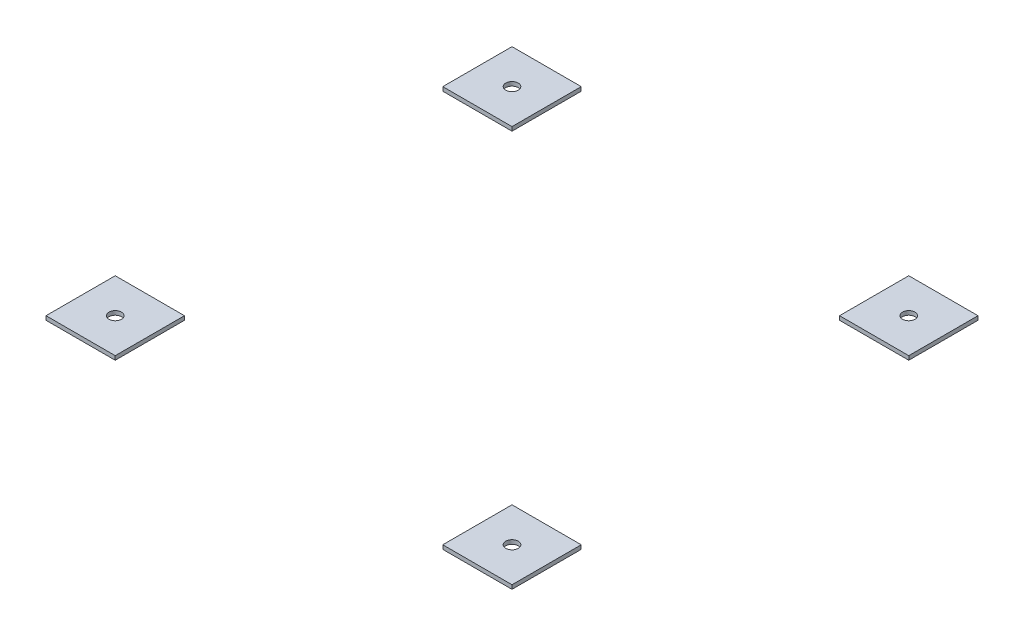
ISO-10303-21;
HEADER;
FILE_DESCRIPTION(('STEP AP214'),'2;1');
FILE_NAME('part.step','',(''),(''),'','','');
FILE_SCHEMA(('AUTOMOTIVE_DESIGN { 1 0 10303 214 1 1 1 1 }'));
ENDSEC;
DATA;
#1=APPLICATION_CONTEXT('core data for automotive mechanical design processes');
#2=APPLICATION_PROTOCOL_DEFINITION('international standard','automotive_design',2000,#1);
#3=PRODUCT_CONTEXT('',#1,'mechanical');
#4=PRODUCT('Part','Part','',(#3));
#5=PRODUCT_RELATED_PRODUCT_CATEGORY('part','',(#4));
#6=PRODUCT_DEFINITION_FORMATION('','',#4);
#7=PRODUCT_DEFINITION_CONTEXT('part definition',#1,'design');
#8=PRODUCT_DEFINITION('design','',#6,#7);
#9=PRODUCT_DEFINITION_SHAPE('','',#8);
#10=(LENGTH_UNIT() NAMED_UNIT(*) SI_UNIT(.MILLI.,.METRE.));
#11=(NAMED_UNIT(*) PLANE_ANGLE_UNIT() SI_UNIT($,.RADIAN.));
#12=(NAMED_UNIT(*) SI_UNIT($,.STERADIAN.) SOLID_ANGLE_UNIT());
#13=UNCERTAINTY_MEASURE_WITH_UNIT(LENGTH_MEASURE(1.E-05),#10,'distance_accuracy_value','');
#14=(GEOMETRIC_REPRESENTATION_CONTEXT(3) GLOBAL_UNCERTAINTY_ASSIGNED_CONTEXT((#13)) GLOBAL_UNIT_ASSIGNED_CONTEXT((#10,
#11,#12)) REPRESENTATION_CONTEXT('',''));
#15=CARTESIAN_POINT('',(0.,0.,0.));
#16=DIRECTION('',(0.,0.,1.));
#17=DIRECTION('',(1.,0.,0.));
#18=AXIS2_PLACEMENT_3D('',#15,#16,#17);
#19=CARTESIAN_POINT('',(0.,1.5,0.));
#20=DIRECTION('',(0.,-1.,0.));
#21=DIRECTION('',(0.,0.,-1.));
#22=AXIS2_PLACEMENT_3D('',#19,#20,#21);
#23=PLANE('',#22);
#24=DIRECTION('',(0.,0.,1.));
#25=VECTOR('',#24,1.);
#26=CARTESIAN_POINT('',(-175.,1.5,175.));
#27=LINE('',#26,#25);
#28=CARTESIAN_POINT('',(-175.,1.5,123.));
#29=VERTEX_POINT('',#28);
#30=CARTESIAN_POINT('',(-175.,1.5,175.));
#31=VERTEX_POINT('',#30);
#32=EDGE_CURVE('E114',#29,#31,#27,.T.);
#33=ORIENTED_EDGE('',*,*,#32,.T.);
#34=DIRECTION('',(1.,0.,0.));
#35=VECTOR('',#34,1.);
#36=CARTESIAN_POINT('',(-175.,1.5,175.));
#37=LINE('',#36,#35);
#38=CARTESIAN_POINT('',(-123.,1.5,175.));
#39=VERTEX_POINT('',#38);
#40=EDGE_CURVE('E83',#31,#39,#37,.T.);
#41=ORIENTED_EDGE('',*,*,#40,.T.);
#42=DIRECTION('',(0.,0.,-1.));
#43=VECTOR('',#42,1.);
#44=CARTESIAN_POINT('',(-123.,1.5,175.));
#45=LINE('',#44,#43);
#46=CARTESIAN_POINT('',(-123.,1.5,123.));
#47=VERTEX_POINT('',#46);
#48=EDGE_CURVE('E122',#39,#47,#45,.T.);
#49=ORIENTED_EDGE('',*,*,#48,.T.);
#50=DIRECTION('',(-1.,0.,0.));
#51=VECTOR('',#50,1.);
#52=CARTESIAN_POINT('',(-175.,1.5,123.));
#53=LINE('',#52,#51);
#54=EDGE_CURVE('E107',#47,#29,#53,.T.);
#55=ORIENTED_EDGE('',*,*,#54,.T.);
#56=EDGE_LOOP('',(#33,#41,#49,#55));
#57=FACE_BOUND('',#56,.T.);
#58=CARTESIAN_POINT('',(-149.,1.5,149.));
#59=DIRECTION('',(0.,1.,0.));
#60=DIRECTION('',(0.,0.,1.));
#61=AXIS2_PLACEMENT_3D('',#58,#59,#60);
#62=CIRCLE('',#61,4.67999999999999);
#63=CARTESIAN_POINT('',(-149.,1.5,153.68));
#64=VERTEX_POINT('',#63);
#65=EDGE_CURVE('E54',#64,#64,#62,.T.);
#66=ORIENTED_EDGE('',*,*,#65,.F.);
#67=EDGE_LOOP('',(#66));
#68=FACE_BOUND('',#67,.T.);
#69=ADVANCED_FACE('F50',(#57,#68),#23,.F.);
#70=CARTESIAN_POINT('',(0.,-1.5,0.));
#71=DIRECTION('',(0.,-1.,0.));
#72=DIRECTION('',(0.,0.,-1.));
#73=AXIS2_PLACEMENT_3D('',#70,#71,#72);
#74=PLANE('',#73);
#75=DIRECTION('',(0.,0.,1.));
#76=VECTOR('',#75,1.);
#77=CARTESIAN_POINT('',(-175.,-1.5,175.));
#78=LINE('',#77,#76);
#79=CARTESIAN_POINT('',(-175.,-1.5,123.));
#80=VERTEX_POINT('',#79);
#81=CARTESIAN_POINT('',(-175.,-1.5,175.));
#82=VERTEX_POINT('',#81);
#83=EDGE_CURVE('E113',#80,#82,#78,.T.);
#84=ORIENTED_EDGE('',*,*,#83,.F.);
#85=DIRECTION('',(-1.,0.,0.));
#86=VECTOR('',#85,1.);
#87=CARTESIAN_POINT('',(-175.,-1.5,123.));
#88=LINE('',#87,#86);
#89=CARTESIAN_POINT('',(-123.,-1.5,123.));
#90=VERTEX_POINT('',#89);
#91=EDGE_CURVE('E93',#90,#80,#88,.T.);
#92=ORIENTED_EDGE('',*,*,#91,.F.);
#93=DIRECTION('',(0.,0.,-1.));
#94=VECTOR('',#93,1.);
#95=CARTESIAN_POINT('',(-123.,-1.5,175.));
#96=LINE('',#95,#94);
#97=CARTESIAN_POINT('',(-123.,-1.5,175.));
#98=VERTEX_POINT('',#97);
#99=EDGE_CURVE('E99',#98,#90,#96,.T.);
#100=ORIENTED_EDGE('',*,*,#99,.F.);
#101=DIRECTION('',(1.,0.,0.));
#102=VECTOR('',#101,1.);
#103=CARTESIAN_POINT('',(-175.,-1.5,175.));
#104=LINE('',#103,#102);
#105=EDGE_CURVE('E67',#82,#98,#104,.T.);
#106=ORIENTED_EDGE('',*,*,#105,.F.);
#107=EDGE_LOOP('',(#84,#92,#100,#106));
#108=FACE_BOUND('',#107,.T.);
#109=CARTESIAN_POINT('',(-149.,-1.5,149.));
#110=DIRECTION('',(0.,1.,0.));
#111=DIRECTION('',(0.,0.,1.));
#112=AXIS2_PLACEMENT_3D('',#109,#110,#111);
#113=CIRCLE('',#112,4.67999999999999);
#114=CARTESIAN_POINT('',(-149.,-1.5,153.68));
#115=VERTEX_POINT('',#114);
#116=EDGE_CURVE('E12',#115,#115,#113,.T.);
#117=ORIENTED_EDGE('',*,*,#116,.T.);
#118=EDGE_LOOP('',(#117));
#119=FACE_BOUND('',#118,.T.);
#120=ADVANCED_FACE('F110',(#108,#119),#74,.T.);
#121=CARTESIAN_POINT('',(-175.,1.5,175.));
#122=DIRECTION('',(1.,0.,0.));
#123=DIRECTION('',(0.,0.,-1.));
#124=AXIS2_PLACEMENT_3D('',#121,#122,#123);
#125=PLANE('',#124);
#126=ORIENTED_EDGE('',*,*,#83,.T.);
#127=DIRECTION('',(0.,-1.,0.));
#128=VECTOR('',#127,1.);
#129=CARTESIAN_POINT('',(-175.,1.5,175.));
#130=LINE('',#129,#128);
#131=EDGE_CURVE('E129',#31,#82,#130,.T.);
#132=ORIENTED_EDGE('',*,*,#131,.F.);
#133=ORIENTED_EDGE('',*,*,#32,.F.);
#134=DIRECTION('',(0.,-1.,0.));
#135=VECTOR('',#134,1.);
#136=CARTESIAN_POINT('',(-175.,1.5,123.));
#137=LINE('',#136,#135);
#138=EDGE_CURVE('E108',#29,#80,#137,.T.);
#139=ORIENTED_EDGE('',*,*,#138,.T.);
#140=EDGE_LOOP('',(#126,#132,#133,#139));
#141=FACE_BOUND('',#140,.T.);
#142=ADVANCED_FACE('F128',(#141),#125,.F.);
#143=CARTESIAN_POINT('',(-175.,1.5,175.));
#144=DIRECTION('',(0.,0.,-1.));
#145=DIRECTION('',(-1.,0.,0.));
#146=AXIS2_PLACEMENT_3D('',#143,#144,#145);
#147=PLANE('',#146);
#148=ORIENTED_EDGE('',*,*,#105,.T.);
#149=DIRECTION('',(0.,-1.,0.));
#150=VECTOR('',#149,1.);
#151=CARTESIAN_POINT('',(-123.,1.5,175.));
#152=LINE('',#151,#150);
#153=EDGE_CURVE('E104',#39,#98,#152,.T.);
#154=ORIENTED_EDGE('',*,*,#153,.F.);
#155=ORIENTED_EDGE('',*,*,#40,.F.);
#156=ORIENTED_EDGE('',*,*,#131,.T.);
#157=EDGE_LOOP('',(#148,#154,#155,#156));
#158=FACE_BOUND('',#157,.T.);
#159=ADVANCED_FACE('F132',(#158),#147,.F.);
#160=CARTESIAN_POINT('',(-123.,1.5,175.));
#161=DIRECTION('',(-1.,0.,0.));
#162=DIRECTION('',(0.,0.,1.));
#163=AXIS2_PLACEMENT_3D('',#160,#161,#162);
#164=PLANE('',#163);
#165=ORIENTED_EDGE('',*,*,#99,.T.);
#166=DIRECTION('',(0.,-1.,0.));
#167=VECTOR('',#166,1.);
#168=CARTESIAN_POINT('',(-123.,1.5,123.));
#169=LINE('',#168,#167);
#170=EDGE_CURVE('E102',#47,#90,#169,.T.);
#171=ORIENTED_EDGE('',*,*,#170,.F.);
#172=ORIENTED_EDGE('',*,*,#48,.F.);
#173=ORIENTED_EDGE('',*,*,#153,.T.);
#174=EDGE_LOOP('',(#165,#171,#172,#173));
#175=FACE_BOUND('',#174,.T.);
#176=ADVANCED_FACE('F100',(#175),#164,.F.);
#177=CARTESIAN_POINT('',(-175.,1.5,123.));
#178=DIRECTION('',(0.,0.,1.));
#179=DIRECTION('',(1.,0.,0.));
#180=AXIS2_PLACEMENT_3D('',#177,#178,#179);
#181=PLANE('',#180);
#182=ORIENTED_EDGE('',*,*,#91,.T.);
#183=ORIENTED_EDGE('',*,*,#138,.F.);
#184=ORIENTED_EDGE('',*,*,#54,.F.);
#185=ORIENTED_EDGE('',*,*,#170,.T.);
#186=EDGE_LOOP('',(#182,#183,#184,#185));
#187=FACE_BOUND('',#186,.T.);
#188=ADVANCED_FACE('F106',(#187),#181,.F.);
#189=CARTESIAN_POINT('',(-149.,1.5,149.));
#190=DIRECTION('',(0.,-1.,0.));
#191=DIRECTION('',(0.,0.,-1.));
#192=AXIS2_PLACEMENT_3D('',#189,#190,#191);
#193=CYLINDRICAL_SURFACE('',#192,4.67999999999999);
#194=ORIENTED_EDGE('',*,*,#65,.T.);
#195=EDGE_LOOP('',(#194));
#196=FACE_BOUND('',#195,.T.);
#197=ORIENTED_EDGE('',*,*,#116,.F.);
#198=EDGE_LOOP('',(#197));
#199=FACE_BOUND('',#198,.T.);
#200=ADVANCED_FACE('F52',(#196,#199),#193,.F.);
#201=CLOSED_SHELL('',(#69,#120,#142,#159,#176,#188,#200));
#202=MANIFOLD_SOLID_BREP('B2',#201);
#203=CARTESIAN_POINT('',(0.,1.5,0.));
#204=DIRECTION('',(0.,-1.,0.));
#205=DIRECTION('',(0.,0.,-1.));
#206=AXIS2_PLACEMENT_3D('',#203,#204,#205);
#207=PLANE('',#206);
#208=DIRECTION('',(0.,0.,1.));
#209=VECTOR('',#208,1.);
#210=CARTESIAN_POINT('',(123.,1.5,175.));
#211=LINE('',#210,#209);
#212=CARTESIAN_POINT('',(123.,1.5,123.));
#213=VERTEX_POINT('',#212);
#214=CARTESIAN_POINT('',(123.,1.5,175.));
#215=VERTEX_POINT('',#214);
#216=EDGE_CURVE('E269',#213,#215,#211,.T.);
#217=ORIENTED_EDGE('',*,*,#216,.T.);
#218=DIRECTION('',(1.,0.,0.));
#219=VECTOR('',#218,1.);
#220=CARTESIAN_POINT('',(123.,1.5,175.));
#221=LINE('',#220,#219);
#222=CARTESIAN_POINT('',(175.,1.5,175.));
#223=VERTEX_POINT('',#222);
#224=EDGE_CURVE('E238',#215,#223,#221,.T.);
#225=ORIENTED_EDGE('',*,*,#224,.T.);
#226=DIRECTION('',(0.,0.,-1.));
#227=VECTOR('',#226,1.);
#228=CARTESIAN_POINT('',(175.,1.5,175.));
#229=LINE('',#228,#227);
#230=CARTESIAN_POINT('',(175.,1.5,123.));
#231=VERTEX_POINT('',#230);
#232=EDGE_CURVE('E277',#223,#231,#229,.T.);
#233=ORIENTED_EDGE('',*,*,#232,.T.);
#234=DIRECTION('',(-1.,0.,0.));
#235=VECTOR('',#234,1.);
#236=CARTESIAN_POINT('',(123.,1.5,123.));
#237=LINE('',#236,#235);
#238=EDGE_CURVE('E262',#231,#213,#237,.T.);
#239=ORIENTED_EDGE('',*,*,#238,.T.);
#240=EDGE_LOOP('',(#217,#225,#233,#239));
#241=FACE_BOUND('',#240,.T.);
#242=CARTESIAN_POINT('',(149.,1.5,149.));
#243=DIRECTION('',(0.,1.,0.));
#244=DIRECTION('',(0.,0.,1.));
#245=AXIS2_PLACEMENT_3D('',#242,#243,#244);
#246=CIRCLE('',#245,4.67999999999999);
#247=CARTESIAN_POINT('',(149.,1.5,153.68));
#248=VERTEX_POINT('',#247);
#249=EDGE_CURVE('E209',#248,#248,#246,.T.);
#250=ORIENTED_EDGE('',*,*,#249,.F.);
#251=EDGE_LOOP('',(#250));
#252=FACE_BOUND('',#251,.T.);
#253=ADVANCED_FACE('F205',(#241,#252),#207,.F.);
#254=CARTESIAN_POINT('',(0.,-1.5,0.));
#255=DIRECTION('',(0.,-1.,0.));
#256=DIRECTION('',(0.,0.,-1.));
#257=AXIS2_PLACEMENT_3D('',#254,#255,#256);
#258=PLANE('',#257);
#259=DIRECTION('',(0.,0.,1.));
#260=VECTOR('',#259,1.);
#261=CARTESIAN_POINT('',(123.,-1.5,175.));
#262=LINE('',#261,#260);
#263=CARTESIAN_POINT('',(123.,-1.5,123.));
#264=VERTEX_POINT('',#263);
#265=CARTESIAN_POINT('',(123.,-1.5,175.));
#266=VERTEX_POINT('',#265);
#267=EDGE_CURVE('E268',#264,#266,#262,.T.);
#268=ORIENTED_EDGE('',*,*,#267,.F.);
#269=DIRECTION('',(-1.,0.,0.));
#270=VECTOR('',#269,1.);
#271=CARTESIAN_POINT('',(123.,-1.5,123.));
#272=LINE('',#271,#270);
#273=CARTESIAN_POINT('',(175.,-1.5,123.));
#274=VERTEX_POINT('',#273);
#275=EDGE_CURVE('E248',#274,#264,#272,.T.);
#276=ORIENTED_EDGE('',*,*,#275,.F.);
#277=DIRECTION('',(0.,0.,-1.));
#278=VECTOR('',#277,1.);
#279=CARTESIAN_POINT('',(175.,-1.5,175.));
#280=LINE('',#279,#278);
#281=CARTESIAN_POINT('',(175.,-1.5,175.));
#282=VERTEX_POINT('',#281);
#283=EDGE_CURVE('E254',#282,#274,#280,.T.);
#284=ORIENTED_EDGE('',*,*,#283,.F.);
#285=DIRECTION('',(1.,0.,0.));
#286=VECTOR('',#285,1.);
#287=CARTESIAN_POINT('',(123.,-1.5,175.));
#288=LINE('',#287,#286);
#289=EDGE_CURVE('E222',#266,#282,#288,.T.);
#290=ORIENTED_EDGE('',*,*,#289,.F.);
#291=EDGE_LOOP('',(#268,#276,#284,#290));
#292=FACE_BOUND('',#291,.T.);
#293=CARTESIAN_POINT('',(149.,-1.5,149.));
#294=DIRECTION('',(0.,1.,0.));
#295=DIRECTION('',(0.,0.,1.));
#296=AXIS2_PLACEMENT_3D('',#293,#294,#295);
#297=CIRCLE('',#296,4.67999999999999);
#298=CARTESIAN_POINT('',(149.,-1.5,153.68));
#299=VERTEX_POINT('',#298);
#300=EDGE_CURVE('E48',#299,#299,#297,.T.);
#301=ORIENTED_EDGE('',*,*,#300,.T.);
#302=EDGE_LOOP('',(#301));
#303=FACE_BOUND('',#302,.T.);
#304=ADVANCED_FACE('F265',(#292,#303),#258,.T.);
#305=CARTESIAN_POINT('',(123.,1.5,175.));
#306=DIRECTION('',(1.,0.,0.));
#307=DIRECTION('',(0.,0.,-1.));
#308=AXIS2_PLACEMENT_3D('',#305,#306,#307);
#309=PLANE('',#308);
#310=ORIENTED_EDGE('',*,*,#267,.T.);
#311=DIRECTION('',(0.,-1.,0.));
#312=VECTOR('',#311,1.);
#313=CARTESIAN_POINT('',(123.,1.5,175.));
#314=LINE('',#313,#312);
#315=EDGE_CURVE('E284',#215,#266,#314,.T.);
#316=ORIENTED_EDGE('',*,*,#315,.F.);
#317=ORIENTED_EDGE('',*,*,#216,.F.);
#318=DIRECTION('',(0.,-1.,0.));
#319=VECTOR('',#318,1.);
#320=CARTESIAN_POINT('',(123.,1.5,123.));
#321=LINE('',#320,#319);
#322=EDGE_CURVE('E263',#213,#264,#321,.T.);
#323=ORIENTED_EDGE('',*,*,#322,.T.);
#324=EDGE_LOOP('',(#310,#316,#317,#323));
#325=FACE_BOUND('',#324,.T.);
#326=ADVANCED_FACE('F283',(#325),#309,.F.);
#327=CARTESIAN_POINT('',(123.,1.5,175.));
#328=DIRECTION('',(0.,0.,-1.));
#329=DIRECTION('',(-1.,0.,0.));
#330=AXIS2_PLACEMENT_3D('',#327,#328,#329);
#331=PLANE('',#330);
#332=ORIENTED_EDGE('',*,*,#289,.T.);
#333=DIRECTION('',(0.,-1.,0.));
#334=VECTOR('',#333,1.);
#335=CARTESIAN_POINT('',(175.,1.5,175.));
#336=LINE('',#335,#334);
#337=EDGE_CURVE('E259',#223,#282,#336,.T.);
#338=ORIENTED_EDGE('',*,*,#337,.F.);
#339=ORIENTED_EDGE('',*,*,#224,.F.);
#340=ORIENTED_EDGE('',*,*,#315,.T.);
#341=EDGE_LOOP('',(#332,#338,#339,#340));
#342=FACE_BOUND('',#341,.T.);
#343=ADVANCED_FACE('F287',(#342),#331,.F.);
#344=CARTESIAN_POINT('',(175.,1.5,175.));
#345=DIRECTION('',(-1.,0.,0.));
#346=DIRECTION('',(0.,0.,1.));
#347=AXIS2_PLACEMENT_3D('',#344,#345,#346);
#348=PLANE('',#347);
#349=ORIENTED_EDGE('',*,*,#283,.T.);
#350=DIRECTION('',(0.,-1.,0.));
#351=VECTOR('',#350,1.);
#352=CARTESIAN_POINT('',(175.,1.5,123.));
#353=LINE('',#352,#351);
#354=EDGE_CURVE('E257',#231,#274,#353,.T.);
#355=ORIENTED_EDGE('',*,*,#354,.F.);
#356=ORIENTED_EDGE('',*,*,#232,.F.);
#357=ORIENTED_EDGE('',*,*,#337,.T.);
#358=EDGE_LOOP('',(#349,#355,#356,#357));
#359=FACE_BOUND('',#358,.T.);
#360=ADVANCED_FACE('F255',(#359),#348,.F.);
#361=CARTESIAN_POINT('',(123.,1.5,123.));
#362=DIRECTION('',(0.,0.,1.));
#363=DIRECTION('',(1.,0.,0.));
#364=AXIS2_PLACEMENT_3D('',#361,#362,#363);
#365=PLANE('',#364);
#366=ORIENTED_EDGE('',*,*,#275,.T.);
#367=ORIENTED_EDGE('',*,*,#322,.F.);
#368=ORIENTED_EDGE('',*,*,#238,.F.);
#369=ORIENTED_EDGE('',*,*,#354,.T.);
#370=EDGE_LOOP('',(#366,#367,#368,#369));
#371=FACE_BOUND('',#370,.T.);
#372=ADVANCED_FACE('F261',(#371),#365,.F.);
#373=CARTESIAN_POINT('',(149.,1.5,149.));
#374=DIRECTION('',(0.,-1.,0.));
#375=DIRECTION('',(0.,0.,-1.));
#376=AXIS2_PLACEMENT_3D('',#373,#374,#375);
#377=CYLINDRICAL_SURFACE('',#376,4.67999999999999);
#378=ORIENTED_EDGE('',*,*,#249,.T.);
#379=EDGE_LOOP('',(#378));
#380=FACE_BOUND('',#379,.T.);
#381=ORIENTED_EDGE('',*,*,#300,.F.);
#382=EDGE_LOOP('',(#381));
#383=FACE_BOUND('',#382,.T.);
#384=ADVANCED_FACE('F207',(#380,#383),#377,.F.);
#385=CLOSED_SHELL('',(#253,#304,#326,#343,#360,#372,#384));
#386=MANIFOLD_SOLID_BREP('B6',#385);
#387=CARTESIAN_POINT('',(0.,1.5,0.));
#388=DIRECTION('',(0.,-1.,0.));
#389=DIRECTION('',(0.,0.,-1.));
#390=AXIS2_PLACEMENT_3D('',#387,#388,#389);
#391=PLANE('',#390);
#392=DIRECTION('',(0.,0.,1.));
#393=VECTOR('',#392,1.);
#394=CARTESIAN_POINT('',(-175.,1.5,-123.));
#395=LINE('',#394,#393);
#396=CARTESIAN_POINT('',(-175.,1.5,-175.));
#397=VERTEX_POINT('',#396);
#398=CARTESIAN_POINT('',(-175.,1.5,-123.));
#399=VERTEX_POINT('',#398);
#400=EDGE_CURVE('E423',#397,#399,#395,.T.);
#401=ORIENTED_EDGE('',*,*,#400,.T.);
#402=DIRECTION('',(1.,0.,0.));
#403=VECTOR('',#402,1.);
#404=CARTESIAN_POINT('',(-175.,1.5,-123.));
#405=LINE('',#404,#403);
#406=CARTESIAN_POINT('',(-123.,1.5,-123.));
#407=VERTEX_POINT('',#406);
#408=EDGE_CURVE('E392',#399,#407,#405,.T.);
#409=ORIENTED_EDGE('',*,*,#408,.T.);
#410=DIRECTION('',(0.,0.,-1.));
#411=VECTOR('',#410,1.);
#412=CARTESIAN_POINT('',(-123.,1.5,-123.));
#413=LINE('',#412,#411);
#414=CARTESIAN_POINT('',(-123.,1.5,-175.));
#415=VERTEX_POINT('',#414);
#416=EDGE_CURVE('E431',#407,#415,#413,.T.);
#417=ORIENTED_EDGE('',*,*,#416,.T.);
#418=DIRECTION('',(-1.,0.,0.));
#419=VECTOR('',#418,1.);
#420=CARTESIAN_POINT('',(-175.,1.5,-175.));
#421=LINE('',#420,#419);
#422=EDGE_CURVE('E416',#415,#397,#421,.T.);
#423=ORIENTED_EDGE('',*,*,#422,.T.);
#424=EDGE_LOOP('',(#401,#409,#417,#423));
#425=FACE_BOUND('',#424,.T.);
#426=CARTESIAN_POINT('',(-149.,1.5,-149.));
#427=DIRECTION('',(0.,1.,0.));
#428=DIRECTION('',(0.,0.,1.));
#429=AXIS2_PLACEMENT_3D('',#426,#427,#428);
#430=CIRCLE('',#429,4.67999999999999);
#431=CARTESIAN_POINT('',(-149.,1.5,-144.32));
#432=VERTEX_POINT('',#431);
#433=EDGE_CURVE('E363',#432,#432,#430,.T.);
#434=ORIENTED_EDGE('',*,*,#433,.F.);
#435=EDGE_LOOP('',(#434));
#436=FACE_BOUND('',#435,.T.);
#437=ADVANCED_FACE('F359',(#425,#436),#391,.F.);
#438=CARTESIAN_POINT('',(0.,-1.5,0.));
#439=DIRECTION('',(0.,-1.,0.));
#440=DIRECTION('',(0.,0.,-1.));
#441=AXIS2_PLACEMENT_3D('',#438,#439,#440);
#442=PLANE('',#441);
#443=DIRECTION('',(0.,0.,1.));
#444=VECTOR('',#443,1.);
#445=CARTESIAN_POINT('',(-175.,-1.5,-123.));
#446=LINE('',#445,#444);
#447=CARTESIAN_POINT('',(-175.,-1.5,-175.));
#448=VERTEX_POINT('',#447);
#449=CARTESIAN_POINT('',(-175.,-1.5,-123.));
#450=VERTEX_POINT('',#449);
#451=EDGE_CURVE('E422',#448,#450,#446,.T.);
#452=ORIENTED_EDGE('',*,*,#451,.F.);
#453=DIRECTION('',(-1.,0.,0.));
#454=VECTOR('',#453,1.);
#455=CARTESIAN_POINT('',(-175.,-1.5,-175.));
#456=LINE('',#455,#454);
#457=CARTESIAN_POINT('',(-123.,-1.5,-175.));
#458=VERTEX_POINT('',#457);
#459=EDGE_CURVE('E402',#458,#448,#456,.T.);
#460=ORIENTED_EDGE('',*,*,#459,.F.);
#461=DIRECTION('',(0.,0.,-1.));
#462=VECTOR('',#461,1.);
#463=CARTESIAN_POINT('',(-123.,-1.5,-123.));
#464=LINE('',#463,#462);
#465=CARTESIAN_POINT('',(-123.,-1.5,-123.));
#466=VERTEX_POINT('',#465);
#467=EDGE_CURVE('E408',#466,#458,#464,.T.);
#468=ORIENTED_EDGE('',*,*,#467,.F.);
#469=DIRECTION('',(1.,0.,0.));
#470=VECTOR('',#469,1.);
#471=CARTESIAN_POINT('',(-175.,-1.5,-123.));
#472=LINE('',#471,#470);
#473=EDGE_CURVE('E376',#450,#466,#472,.T.);
#474=ORIENTED_EDGE('',*,*,#473,.F.);
#475=EDGE_LOOP('',(#452,#460,#468,#474));
#476=FACE_BOUND('',#475,.T.);
#477=CARTESIAN_POINT('',(-149.,-1.5,-149.));
#478=DIRECTION('',(0.,1.,0.));
#479=DIRECTION('',(0.,0.,1.));
#480=AXIS2_PLACEMENT_3D('',#477,#478,#479);
#481=CIRCLE('',#480,4.67999999999999);
#482=CARTESIAN_POINT('',(-149.,-1.5,-144.32));
#483=VERTEX_POINT('',#482);
#484=EDGE_CURVE('E203',#483,#483,#481,.T.);
#485=ORIENTED_EDGE('',*,*,#484,.T.);
#486=EDGE_LOOP('',(#485));
#487=FACE_BOUND('',#486,.T.);
#488=ADVANCED_FACE('F419',(#476,#487),#442,.T.);
#489=CARTESIAN_POINT('',(-175.,1.5,-123.));
#490=DIRECTION('',(1.,0.,0.));
#491=DIRECTION('',(0.,0.,-1.));
#492=AXIS2_PLACEMENT_3D('',#489,#490,#491);
#493=PLANE('',#492);
#494=ORIENTED_EDGE('',*,*,#451,.T.);
#495=DIRECTION('',(0.,-1.,0.));
#496=VECTOR('',#495,1.);
#497=CARTESIAN_POINT('',(-175.,1.5,-123.));
#498=LINE('',#497,#496);
#499=EDGE_CURVE('E438',#399,#450,#498,.T.);
#500=ORIENTED_EDGE('',*,*,#499,.F.);
#501=ORIENTED_EDGE('',*,*,#400,.F.);
#502=DIRECTION('',(0.,-1.,0.));
#503=VECTOR('',#502,1.);
#504=CARTESIAN_POINT('',(-175.,1.5,-175.));
#505=LINE('',#504,#503);
#506=EDGE_CURVE('E417',#397,#448,#505,.T.);
#507=ORIENTED_EDGE('',*,*,#506,.T.);
#508=EDGE_LOOP('',(#494,#500,#501,#507));
#509=FACE_BOUND('',#508,.T.);
#510=ADVANCED_FACE('F437',(#509),#493,.F.);
#511=CARTESIAN_POINT('',(-175.,1.5,-123.));
#512=DIRECTION('',(0.,0.,-1.));
#513=DIRECTION('',(-1.,0.,0.));
#514=AXIS2_PLACEMENT_3D('',#511,#512,#513);
#515=PLANE('',#514);
#516=ORIENTED_EDGE('',*,*,#473,.T.);
#517=DIRECTION('',(0.,-1.,0.));
#518=VECTOR('',#517,1.);
#519=CARTESIAN_POINT('',(-123.,1.5,-123.));
#520=LINE('',#519,#518);
#521=EDGE_CURVE('E413',#407,#466,#520,.T.);
#522=ORIENTED_EDGE('',*,*,#521,.F.);
#523=ORIENTED_EDGE('',*,*,#408,.F.);
#524=ORIENTED_EDGE('',*,*,#499,.T.);
#525=EDGE_LOOP('',(#516,#522,#523,#524));
#526=FACE_BOUND('',#525,.T.);
#527=ADVANCED_FACE('F441',(#526),#515,.F.);
#528=CARTESIAN_POINT('',(-123.,1.5,-123.));
#529=DIRECTION('',(-1.,0.,0.));
#530=DIRECTION('',(0.,0.,1.));
#531=AXIS2_PLACEMENT_3D('',#528,#529,#530);
#532=PLANE('',#531);
#533=ORIENTED_EDGE('',*,*,#467,.T.);
#534=DIRECTION('',(0.,-1.,0.));
#535=VECTOR('',#534,1.);
#536=CARTESIAN_POINT('',(-123.,1.5,-175.));
#537=LINE('',#536,#535);
#538=EDGE_CURVE('E411',#415,#458,#537,.T.);
#539=ORIENTED_EDGE('',*,*,#538,.F.);
#540=ORIENTED_EDGE('',*,*,#416,.F.);
#541=ORIENTED_EDGE('',*,*,#521,.T.);
#542=EDGE_LOOP('',(#533,#539,#540,#541));
#543=FACE_BOUND('',#542,.T.);
#544=ADVANCED_FACE('F409',(#543),#532,.F.);
#545=CARTESIAN_POINT('',(-175.,1.5,-175.));
#546=DIRECTION('',(0.,0.,1.));
#547=DIRECTION('',(1.,0.,0.));
#548=AXIS2_PLACEMENT_3D('',#545,#546,#547);
#549=PLANE('',#548);
#550=ORIENTED_EDGE('',*,*,#459,.T.);
#551=ORIENTED_EDGE('',*,*,#506,.F.);
#552=ORIENTED_EDGE('',*,*,#422,.F.);
#553=ORIENTED_EDGE('',*,*,#538,.T.);
#554=EDGE_LOOP('',(#550,#551,#552,#553));
#555=FACE_BOUND('',#554,.T.);
#556=ADVANCED_FACE('F415',(#555),#549,.F.);
#557=CARTESIAN_POINT('',(-149.,1.5,-149.));
#558=DIRECTION('',(0.,-1.,0.));
#559=DIRECTION('',(0.,0.,-1.));
#560=AXIS2_PLACEMENT_3D('',#557,#558,#559);
#561=CYLINDRICAL_SURFACE('',#560,4.67999999999999);
#562=ORIENTED_EDGE('',*,*,#433,.T.);
#563=EDGE_LOOP('',(#562));
#564=FACE_BOUND('',#563,.T.);
#565=ORIENTED_EDGE('',*,*,#484,.F.);
#566=EDGE_LOOP('',(#565));
#567=FACE_BOUND('',#566,.T.);
#568=ADVANCED_FACE('F361',(#564,#567),#561,.F.);
#569=CLOSED_SHELL('',(#437,#488,#510,#527,#544,#556,#568));
#570=MANIFOLD_SOLID_BREP('B42',#569);
#571=CARTESIAN_POINT('',(0.,1.5,0.));
#572=DIRECTION('',(0.,-1.,0.));
#573=DIRECTION('',(0.,0.,-1.));
#574=AXIS2_PLACEMENT_3D('',#571,#572,#573);
#575=PLANE('',#574);
#576=DIRECTION('',(0.,0.,1.));
#577=VECTOR('',#576,1.);
#578=CARTESIAN_POINT('',(123.,1.5,-123.));
#579=LINE('',#578,#577);
#580=CARTESIAN_POINT('',(123.,1.5,-175.));
#581=VERTEX_POINT('',#580);
#582=CARTESIAN_POINT('',(123.,1.5,-123.));
#583=VERTEX_POINT('',#582);
#584=EDGE_CURVE('E556',#581,#583,#579,.T.);
#585=ORIENTED_EDGE('',*,*,#584,.T.);
#586=DIRECTION('',(1.,0.,0.));
#587=VECTOR('',#586,1.);
#588=CARTESIAN_POINT('',(123.,1.5,-123.));
#589=LINE('',#588,#587);
#590=CARTESIAN_POINT('',(175.,1.5,-123.));
#591=VERTEX_POINT('',#590);
#592=EDGE_CURVE('E551',#583,#591,#589,.T.);
#593=ORIENTED_EDGE('',*,*,#592,.T.);
#594=DIRECTION('',(0.,0.,-1.));
#595=VECTOR('',#594,1.);
#596=CARTESIAN_POINT('',(175.,1.5,-123.));
#597=LINE('',#596,#595);
#598=CARTESIAN_POINT('',(175.,1.5,-175.));
#599=VERTEX_POINT('',#598);
#600=EDGE_CURVE('E554',#591,#599,#597,.T.);
#601=ORIENTED_EDGE('',*,*,#600,.T.);
#602=DIRECTION('',(-1.,0.,0.));
#603=VECTOR('',#602,1.);
#604=CARTESIAN_POINT('',(123.,1.5,-175.));
#605=LINE('',#604,#603);
#606=EDGE_CURVE('E521',#599,#581,#605,.T.);
#607=ORIENTED_EDGE('',*,*,#606,.T.);
#608=EDGE_LOOP('',(#585,#593,#601,#607));
#609=FACE_BOUND('',#608,.T.);
#610=CARTESIAN_POINT('',(149.,1.5,-149.));
#611=DIRECTION('',(0.,1.,0.));
#612=DIRECTION('',(0.,0.,1.));
#613=AXIS2_PLACEMENT_3D('',#610,#611,#612);
#614=CIRCLE('',#613,4.67999999999999);
#615=CARTESIAN_POINT('',(149.,1.5,-144.32));
#616=VERTEX_POINT('',#615);
#617=EDGE_CURVE('E571',#616,#616,#614,.T.);
#618=ORIENTED_EDGE('',*,*,#617,.F.);
#619=EDGE_LOOP('',(#618));
#620=FACE_BOUND('',#619,.T.);
#621=ADVANCED_FACE('F504',(#609,#620),#575,.F.);
#622=CARTESIAN_POINT('',(0.,-1.5,0.));
#623=DIRECTION('',(0.,-1.,0.));
#624=DIRECTION('',(0.,0.,-1.));
#625=AXIS2_PLACEMENT_3D('',#622,#623,#624);
#626=PLANE('',#625);
#627=DIRECTION('',(0.,0.,1.));
#628=VECTOR('',#627,1.);
#629=CARTESIAN_POINT('',(123.,-1.5,-123.));
#630=LINE('',#629,#628);
#631=CARTESIAN_POINT('',(123.,-1.5,-175.));
#632=VERTEX_POINT('',#631);
#633=CARTESIAN_POINT('',(123.,-1.5,-123.));
#634=VERTEX_POINT('',#633);
#635=EDGE_CURVE('E568',#632,#634,#630,.T.);
#636=ORIENTED_EDGE('',*,*,#635,.F.);
#637=DIRECTION('',(-1.,0.,0.));
#638=VECTOR('',#637,1.);
#639=CARTESIAN_POINT('',(123.,-1.5,-175.));
#640=LINE('',#639,#638);
#641=CARTESIAN_POINT('',(175.,-1.5,-175.));
#642=VERTEX_POINT('',#641);
#643=EDGE_CURVE('E544',#642,#632,#640,.T.);
#644=ORIENTED_EDGE('',*,*,#643,.F.);
#645=DIRECTION('',(0.,0.,-1.));
#646=VECTOR('',#645,1.);
#647=CARTESIAN_POINT('',(175.,-1.5,-123.));
#648=LINE('',#647,#646);
#649=CARTESIAN_POINT('',(175.,-1.5,-123.));
#650=VERTEX_POINT('',#649);
#651=EDGE_CURVE('E538',#650,#642,#648,.T.);
#652=ORIENTED_EDGE('',*,*,#651,.F.);
#653=DIRECTION('',(1.,0.,0.));
#654=VECTOR('',#653,1.);
#655=CARTESIAN_POINT('',(123.,-1.5,-123.));
#656=LINE('',#655,#654);
#657=EDGE_CURVE('E560',#634,#650,#656,.T.);
#658=ORIENTED_EDGE('',*,*,#657,.F.);
#659=EDGE_LOOP('',(#636,#644,#652,#658));
#660=FACE_BOUND('',#659,.T.);
#661=CARTESIAN_POINT('',(149.,-1.5,-149.));
#662=DIRECTION('',(0.,1.,0.));
#663=DIRECTION('',(0.,0.,1.));
#664=AXIS2_PLACEMENT_3D('',#661,#662,#663);
#665=CIRCLE('',#664,4.67999999999999);
#666=CARTESIAN_POINT('',(149.,-1.5,-144.32));
#667=VERTEX_POINT('',#666);
#668=EDGE_CURVE('E583',#667,#667,#665,.T.);
#669=ORIENTED_EDGE('',*,*,#668,.T.);
#670=EDGE_LOOP('',(#669));
#671=FACE_BOUND('',#670,.T.);
#672=ADVANCED_FACE('F579',(#660,#671),#626,.T.);
#673=CARTESIAN_POINT('',(123.,1.5,-123.));
#674=DIRECTION('',(1.,0.,0.));
#675=DIRECTION('',(0.,0.,-1.));
#676=AXIS2_PLACEMENT_3D('',#673,#674,#675);
#677=PLANE('',#676);
#678=ORIENTED_EDGE('',*,*,#635,.T.);
#679=DIRECTION('',(0.,-1.,0.));
#680=VECTOR('',#679,1.);
#681=CARTESIAN_POINT('',(123.,1.5,-123.));
#682=LINE('',#681,#680);
#683=EDGE_CURVE('E357',#583,#634,#682,.T.);
#684=ORIENTED_EDGE('',*,*,#683,.F.);
#685=ORIENTED_EDGE('',*,*,#584,.F.);
#686=DIRECTION('',(0.,-1.,0.));
#687=VECTOR('',#686,1.);
#688=CARTESIAN_POINT('',(123.,1.5,-175.));
#689=LINE('',#688,#687);
#690=EDGE_CURVE('E564',#581,#632,#689,.T.);
#691=ORIENTED_EDGE('',*,*,#690,.T.);
#692=EDGE_LOOP('',(#678,#684,#685,#691));
#693=FACE_BOUND('',#692,.T.);
#694=ADVANCED_FACE('F506',(#693),#677,.F.);
#695=CARTESIAN_POINT('',(123.,1.5,-123.));
#696=DIRECTION('',(0.,0.,-1.));
#697=DIRECTION('',(-1.,0.,0.));
#698=AXIS2_PLACEMENT_3D('',#695,#696,#697);
#699=PLANE('',#698);
#700=ORIENTED_EDGE('',*,*,#657,.T.);
#701=DIRECTION('',(0.,-1.,0.));
#702=VECTOR('',#701,1.);
#703=CARTESIAN_POINT('',(175.,1.5,-123.));
#704=LINE('',#703,#702);
#705=EDGE_CURVE('E513',#591,#650,#704,.T.);
#706=ORIENTED_EDGE('',*,*,#705,.F.);
#707=ORIENTED_EDGE('',*,*,#592,.F.);
#708=ORIENTED_EDGE('',*,*,#683,.T.);
#709=EDGE_LOOP('',(#700,#706,#707,#708));
#710=FACE_BOUND('',#709,.T.);
#711=ADVANCED_FACE('F559',(#710),#699,.F.);
#712=CARTESIAN_POINT('',(175.,1.5,-123.));
#713=DIRECTION('',(-1.,0.,0.));
#714=DIRECTION('',(0.,0.,1.));
#715=AXIS2_PLACEMENT_3D('',#712,#713,#714);
#716=PLANE('',#715);
#717=ORIENTED_EDGE('',*,*,#651,.T.);
#718=DIRECTION('',(0.,-1.,0.));
#719=VECTOR('',#718,1.);
#720=CARTESIAN_POINT('',(175.,1.5,-175.));
#721=LINE('',#720,#719);
#722=EDGE_CURVE('E561',#599,#642,#721,.T.);
#723=ORIENTED_EDGE('',*,*,#722,.F.);
#724=ORIENTED_EDGE('',*,*,#600,.F.);
#725=ORIENTED_EDGE('',*,*,#705,.T.);
#726=EDGE_LOOP('',(#717,#723,#724,#725));
#727=FACE_BOUND('',#726,.T.);
#728=ADVANCED_FACE('F562',(#727),#716,.F.);
#729=CARTESIAN_POINT('',(123.,1.5,-175.));
#730=DIRECTION('',(0.,0.,1.));
#731=DIRECTION('',(1.,0.,0.));
#732=AXIS2_PLACEMENT_3D('',#729,#730,#731);
#733=PLANE('',#732);
#734=ORIENTED_EDGE('',*,*,#643,.T.);
#735=ORIENTED_EDGE('',*,*,#690,.F.);
#736=ORIENTED_EDGE('',*,*,#606,.F.);
#737=ORIENTED_EDGE('',*,*,#722,.T.);
#738=EDGE_LOOP('',(#734,#735,#736,#737));
#739=FACE_BOUND('',#738,.T.);
#740=ADVANCED_FACE('F576',(#739),#733,.F.);
#741=CARTESIAN_POINT('',(149.,1.5,-149.));
#742=DIRECTION('',(0.,-1.,0.));
#743=DIRECTION('',(0.,0.,-1.));
#744=AXIS2_PLACEMENT_3D('',#741,#742,#743);
#745=CYLINDRICAL_SURFACE('',#744,4.67999999999999);
#746=ORIENTED_EDGE('',*,*,#617,.T.);
#747=EDGE_LOOP('',(#746));
#748=FACE_BOUND('',#747,.T.);
#749=ORIENTED_EDGE('',*,*,#668,.F.);
#750=EDGE_LOOP('',(#749));
#751=FACE_BOUND('',#750,.T.);
#752=ADVANCED_FACE('F589',(#748,#751),#745,.F.);
#753=CLOSED_SHELL('',(#621,#672,#694,#711,#728,#740,#752));
#754=MANIFOLD_SOLID_BREP('B197',#753);
#755=ADVANCED_BREP_SHAPE_REPRESENTATION('',(#18,#202,#386,#570,#754),#14);
#756=SHAPE_DEFINITION_REPRESENTATION(#9,#755);
ENDSEC;
END-ISO-10303-21;
